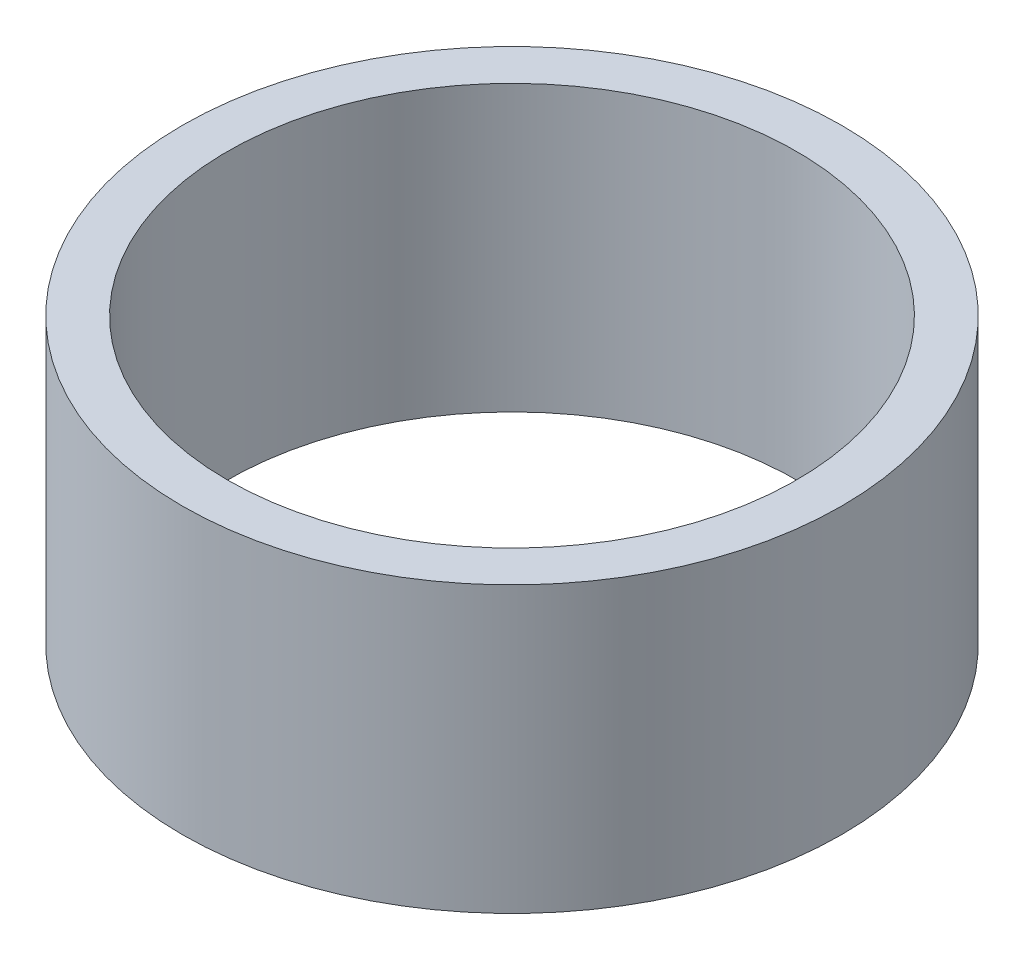
ISO-10303-21;
HEADER;
FILE_DESCRIPTION(('STEP AP214'),'2;1');
FILE_NAME('part.step','',(''),(''),'','','');
FILE_SCHEMA(('AUTOMOTIVE_DESIGN { 1 0 10303 214 1 1 1 1 }'));
ENDSEC;
DATA;
#1=APPLICATION_CONTEXT('core data for automotive mechanical design processes');
#2=APPLICATION_PROTOCOL_DEFINITION('international standard','automotive_design',2000,#1);
#3=PRODUCT_CONTEXT('',#1,'mechanical');
#4=PRODUCT('Part','Part','',(#3));
#5=PRODUCT_RELATED_PRODUCT_CATEGORY('part','',(#4));
#6=PRODUCT_DEFINITION_FORMATION('','',#4);
#7=PRODUCT_DEFINITION_CONTEXT('part definition',#1,'design');
#8=PRODUCT_DEFINITION('design','',#6,#7);
#9=PRODUCT_DEFINITION_SHAPE('','',#8);
#10=(LENGTH_UNIT() NAMED_UNIT(*) SI_UNIT(.MILLI.,.METRE.));
#11=(NAMED_UNIT(*) PLANE_ANGLE_UNIT() SI_UNIT($,.RADIAN.));
#12=(NAMED_UNIT(*) SI_UNIT($,.STERADIAN.) SOLID_ANGLE_UNIT());
#13=UNCERTAINTY_MEASURE_WITH_UNIT(LENGTH_MEASURE(1.E-05),#10,'distance_accuracy_value','');
#14=(GEOMETRIC_REPRESENTATION_CONTEXT(3) GLOBAL_UNCERTAINTY_ASSIGNED_CONTEXT((#13)) GLOBAL_UNIT_ASSIGNED_CONTEXT((#10,
#11,#12)) REPRESENTATION_CONTEXT('',''));
#15=CARTESIAN_POINT('',(0.,0.,0.));
#16=DIRECTION('',(0.,0.,1.));
#17=DIRECTION('',(1.,0.,0.));
#18=AXIS2_PLACEMENT_3D('',#15,#16,#17);
#19=CARTESIAN_POINT('',(0.,4.1,0.));
#20=DIRECTION('',(0.,1.,0.));
#21=DIRECTION('',(0.,0.,1.));
#22=AXIS2_PLACEMENT_3D('',#19,#20,#21);
#23=PLANE('',#22);
#24=CARTESIAN_POINT('',(0.,4.1,0.));
#25=DIRECTION('',(0.,1.,0.));
#26=DIRECTION('',(0.,0.,1.));
#27=AXIS2_PLACEMENT_3D('',#24,#25,#26);
#28=CIRCLE('',#27,4.75);
#29=CARTESIAN_POINT('',(0.,4.1,4.75));
#30=VERTEX_POINT('',#29);
#31=EDGE_CURVE('E10',#30,#30,#28,.T.);
#32=ORIENTED_EDGE('',*,*,#31,.T.);
#33=EDGE_LOOP('',(#32));
#34=FACE_BOUND('',#33,.T.);
#35=CARTESIAN_POINT('',(0.,4.1,0.));
#36=DIRECTION('',(0.,1.,0.));
#37=DIRECTION('',(0.,0.,1.));
#38=AXIS2_PLACEMENT_3D('',#35,#36,#37);
#39=CIRCLE('',#38,4.1);
#40=CARTESIAN_POINT('',(0.,4.1,4.1));
#41=VERTEX_POINT('',#40);
#42=EDGE_CURVE('E56',#41,#41,#39,.T.);
#43=ORIENTED_EDGE('',*,*,#42,.F.);
#44=EDGE_LOOP('',(#43));
#45=FACE_BOUND('',#44,.T.);
#46=ADVANCED_FACE('F43',(#34,#45),#23,.T.);
#47=CARTESIAN_POINT('',(0.,0.,0.));
#48=DIRECTION('',(0.,1.,0.));
#49=DIRECTION('',(0.,0.,1.));
#50=AXIS2_PLACEMENT_3D('',#47,#48,#49);
#51=PLANE('',#50);
#52=CARTESIAN_POINT('',(0.,0.,0.));
#53=DIRECTION('',(0.,1.,0.));
#54=DIRECTION('',(0.,0.,1.));
#55=AXIS2_PLACEMENT_3D('',#52,#53,#54);
#56=CIRCLE('',#55,4.75);
#57=CARTESIAN_POINT('',(0.,0.,4.75));
#58=VERTEX_POINT('',#57);
#59=EDGE_CURVE('E47',#58,#58,#56,.T.);
#60=ORIENTED_EDGE('',*,*,#59,.F.);
#61=EDGE_LOOP('',(#60));
#62=FACE_BOUND('',#61,.T.);
#63=CARTESIAN_POINT('',(0.,0.,0.));
#64=DIRECTION('',(0.,1.,0.));
#65=DIRECTION('',(0.,0.,1.));
#66=AXIS2_PLACEMENT_3D('',#63,#64,#65);
#67=CIRCLE('',#66,4.1);
#68=CARTESIAN_POINT('',(0.,0.,4.1));
#69=VERTEX_POINT('',#68);
#70=EDGE_CURVE('E58',#69,#69,#67,.T.);
#71=ORIENTED_EDGE('',*,*,#70,.T.);
#72=EDGE_LOOP('',(#71));
#73=FACE_BOUND('',#72,.T.);
#74=ADVANCED_FACE('F70',(#62,#73),#51,.F.);
#75=CARTESIAN_POINT('',(0.,4.1,0.));
#76=DIRECTION('',(0.,-1.,0.));
#77=DIRECTION('',(0.,0.,-1.));
#78=AXIS2_PLACEMENT_3D('',#75,#76,#77);
#79=CYLINDRICAL_SURFACE('',#78,4.75);
#80=ORIENTED_EDGE('',*,*,#31,.F.);
#81=EDGE_LOOP('',(#80));
#82=FACE_BOUND('',#81,.T.);
#83=ORIENTED_EDGE('',*,*,#59,.T.);
#84=EDGE_LOOP('',(#83));
#85=FACE_BOUND('',#84,.T.);
#86=ADVANCED_FACE('F45',(#82,#85),#79,.T.);
#87=CARTESIAN_POINT('',(0.,4.1,0.));
#88=DIRECTION('',(0.,-1.,0.));
#89=DIRECTION('',(0.,0.,-1.));
#90=AXIS2_PLACEMENT_3D('',#87,#88,#89);
#91=CYLINDRICAL_SURFACE('',#90,4.1);
#92=ORIENTED_EDGE('',*,*,#42,.T.);
#93=EDGE_LOOP('',(#92));
#94=FACE_BOUND('',#93,.T.);
#95=ORIENTED_EDGE('',*,*,#70,.F.);
#96=EDGE_LOOP('',(#95));
#97=FACE_BOUND('',#96,.T.);
#98=ADVANCED_FACE('F66',(#94,#97),#91,.F.);
#99=CLOSED_SHELL('',(#46,#74,#86,#98));
#100=MANIFOLD_SOLID_BREP('B2',#99);
#101=ADVANCED_BREP_SHAPE_REPRESENTATION('',(#18,#100),#14);
#102=SHAPE_DEFINITION_REPRESENTATION(#9,#101);
ENDSEC;
END-ISO-10303-21;
